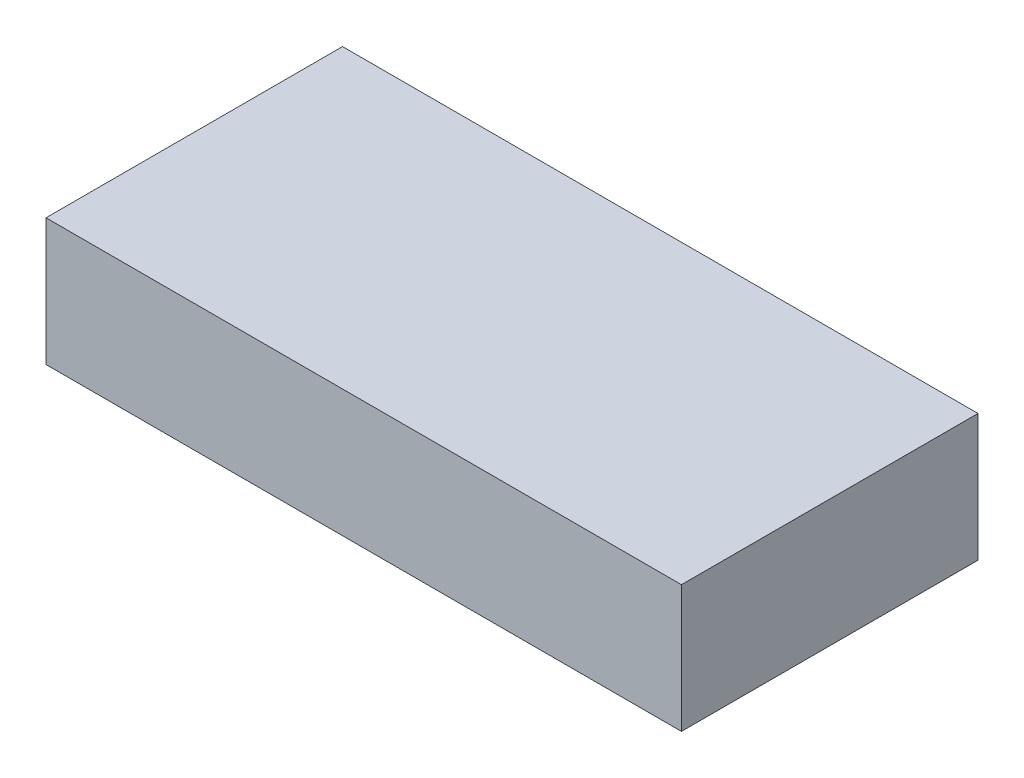
ISO-10303-21;
HEADER;
FILE_DESCRIPTION(('STEP AP214'),'2;1');
FILE_NAME('part.step','',(''),(''),'','','');
FILE_SCHEMA(('AUTOMOTIVE_DESIGN { 1 0 10303 214 1 1 1 1 }'));
ENDSEC;
DATA;
#1=APPLICATION_CONTEXT('core data for automotive mechanical design processes');
#2=APPLICATION_PROTOCOL_DEFINITION('international standard','automotive_design',2000,#1);
#3=PRODUCT_CONTEXT('',#1,'mechanical');
#4=PRODUCT('Part','Part','',(#3));
#5=PRODUCT_RELATED_PRODUCT_CATEGORY('part','',(#4));
#6=PRODUCT_DEFINITION_FORMATION('','',#4);
#7=PRODUCT_DEFINITION_CONTEXT('part definition',#1,'design');
#8=PRODUCT_DEFINITION('design','',#6,#7);
#9=PRODUCT_DEFINITION_SHAPE('','',#8);
#10=(LENGTH_UNIT() NAMED_UNIT(*) SI_UNIT(.MILLI.,.METRE.));
#11=(NAMED_UNIT(*) PLANE_ANGLE_UNIT() SI_UNIT($,.RADIAN.));
#12=(NAMED_UNIT(*) SI_UNIT($,.STERADIAN.) SOLID_ANGLE_UNIT());
#13=UNCERTAINTY_MEASURE_WITH_UNIT(LENGTH_MEASURE(1.E-05),#10,'distance_accuracy_value','');
#14=(GEOMETRIC_REPRESENTATION_CONTEXT(3) GLOBAL_UNCERTAINTY_ASSIGNED_CONTEXT((#13)) GLOBAL_UNIT_ASSIGNED_CONTEXT((#10,
#11,#12)) REPRESENTATION_CONTEXT('',''));
#15=CARTESIAN_POINT('',(0.,0.,0.));
#16=DIRECTION('',(0.,0.,1.));
#17=DIRECTION('',(1.,0.,0.));
#18=AXIS2_PLACEMENT_3D('',#15,#16,#17);
#19=CARTESIAN_POINT('',(-40.4484304932735,15.,-18.2959641255605));
#20=DIRECTION('',(1.,0.,0.));
#21=DIRECTION('',(0.,0.,-1.));
#22=AXIS2_PLACEMENT_3D('',#19,#20,#21);
#23=PLANE('',#22);
#24=DIRECTION('',(0.,0.,1.));
#25=VECTOR('',#24,1.);
#26=CARTESIAN_POINT('',(-40.4484304932735,0.,-18.2959641255605));
#27=LINE('',#26,#25);
#28=CARTESIAN_POINT('',(-40.4484304932735,0.,-18.2959641255605));
#29=VERTEX_POINT('',#28);
#30=CARTESIAN_POINT('',(-40.4484304932735,0.,16.7040358744395));
#31=VERTEX_POINT('',#30);
#32=EDGE_CURVE('E98',#29,#31,#27,.T.);
#33=ORIENTED_EDGE('',*,*,#32,.T.);
#34=DIRECTION('',(0.,-1.,0.));
#35=VECTOR('',#34,1.);
#36=CARTESIAN_POINT('',(-40.4484304932735,15.,16.7040358744395));
#37=LINE('',#36,#35);
#38=CARTESIAN_POINT('',(-40.4484304932735,15.,16.7040358744395));
#39=VERTEX_POINT('',#38);
#40=EDGE_CURVE('E11',#39,#31,#37,.T.);
#41=ORIENTED_EDGE('',*,*,#40,.F.);
#42=DIRECTION('',(0.,0.,1.));
#43=VECTOR('',#42,1.);
#44=CARTESIAN_POINT('',(-40.4484304932735,15.,-18.2959641255605));
#45=LINE('',#44,#43);
#46=CARTESIAN_POINT('',(-40.4484304932735,15.,-18.2959641255605));
#47=VERTEX_POINT('',#46);
#48=EDGE_CURVE('E86',#47,#39,#45,.T.);
#49=ORIENTED_EDGE('',*,*,#48,.F.);
#50=DIRECTION('',(0.,-1.,0.));
#51=VECTOR('',#50,1.);
#52=CARTESIAN_POINT('',(-40.4484304932735,15.,-18.2959641255605));
#53=LINE('',#52,#51);
#54=EDGE_CURVE('E94',#47,#29,#53,.T.);
#55=ORIENTED_EDGE('',*,*,#54,.T.);
#56=EDGE_LOOP('',(#33,#41,#49,#55));
#57=FACE_BOUND('',#56,.T.);
#58=ADVANCED_FACE('F35',(#57),#23,.F.);
#59=CARTESIAN_POINT('',(-40.4484304932735,15.,16.7040358744395));
#60=DIRECTION('',(0.,0.,-1.));
#61=DIRECTION('',(-1.,0.,0.));
#62=AXIS2_PLACEMENT_3D('',#59,#60,#61);
#63=PLANE('',#62);
#64=DIRECTION('',(1.,0.,0.));
#65=VECTOR('',#64,1.);
#66=CARTESIAN_POINT('',(-40.4484304932735,0.,16.7040358744395));
#67=LINE('',#66,#65);
#68=CARTESIAN_POINT('',(34.5515695067265,0.,16.7040358744395));
#69=VERTEX_POINT('',#68);
#70=EDGE_CURVE('E90',#31,#69,#67,.T.);
#71=ORIENTED_EDGE('',*,*,#70,.T.);
#72=DIRECTION('',(0.,-1.,0.));
#73=VECTOR('',#72,1.);
#74=CARTESIAN_POINT('',(34.5515695067265,15.,16.7040358744395));
#75=LINE('',#74,#73);
#76=CARTESIAN_POINT('',(34.5515695067265,15.,16.7040358744395));
#77=VERTEX_POINT('',#76);
#78=EDGE_CURVE('E43',#77,#69,#75,.T.);
#79=ORIENTED_EDGE('',*,*,#78,.F.);
#80=DIRECTION('',(1.,0.,0.));
#81=VECTOR('',#80,1.);
#82=CARTESIAN_POINT('',(-40.4484304932735,15.,16.7040358744395));
#83=LINE('',#82,#81);
#84=EDGE_CURVE('E81',#39,#77,#83,.T.);
#85=ORIENTED_EDGE('',*,*,#84,.F.);
#86=ORIENTED_EDGE('',*,*,#40,.T.);
#87=EDGE_LOOP('',(#71,#79,#85,#86));
#88=FACE_BOUND('',#87,.T.);
#89=ADVANCED_FACE('F89',(#88),#63,.F.);
#90=CARTESIAN_POINT('',(34.5515695067265,15.,-18.2959641255605));
#91=DIRECTION('',(-1.,0.,0.));
#92=DIRECTION('',(0.,0.,1.));
#93=AXIS2_PLACEMENT_3D('',#90,#91,#92);
#94=PLANE('',#93);
#95=DIRECTION('',(0.,0.,-1.));
#96=VECTOR('',#95,1.);
#97=CARTESIAN_POINT('',(34.5515695067265,0.,-18.2959641255605));
#98=LINE('',#97,#96);
#99=CARTESIAN_POINT('',(34.5515695067265,0.,-18.2959641255605));
#100=VERTEX_POINT('',#99);
#101=EDGE_CURVE('E68',#69,#100,#98,.T.);
#102=ORIENTED_EDGE('',*,*,#101,.T.);
#103=DIRECTION('',(0.,-1.,0.));
#104=VECTOR('',#103,1.);
#105=CARTESIAN_POINT('',(34.5515695067265,15.,-18.2959641255605));
#106=LINE('',#105,#104);
#107=CARTESIAN_POINT('',(34.5515695067265,15.,-18.2959641255605));
#108=VERTEX_POINT('',#107);
#109=EDGE_CURVE('E91',#108,#100,#106,.T.);
#110=ORIENTED_EDGE('',*,*,#109,.F.);
#111=DIRECTION('',(0.,0.,-1.));
#112=VECTOR('',#111,1.);
#113=CARTESIAN_POINT('',(34.5515695067265,15.,-18.2959641255605));
#114=LINE('',#113,#112);
#115=EDGE_CURVE('E84',#77,#108,#114,.T.);
#116=ORIENTED_EDGE('',*,*,#115,.F.);
#117=ORIENTED_EDGE('',*,*,#78,.T.);
#118=EDGE_LOOP('',(#102,#110,#116,#117));
#119=FACE_BOUND('',#118,.T.);
#120=ADVANCED_FACE('F92',(#119),#94,.F.);
#121=CARTESIAN_POINT('',(-40.4484304932735,15.,-18.2959641255605));
#122=DIRECTION('',(0.,0.,1.));
#123=DIRECTION('',(1.,0.,0.));
#124=AXIS2_PLACEMENT_3D('',#121,#122,#123);
#125=PLANE('',#124);
#126=DIRECTION('',(-1.,0.,0.));
#127=VECTOR('',#126,1.);
#128=CARTESIAN_POINT('',(-40.4484304932735,0.,-18.2959641255605));
#129=LINE('',#128,#127);
#130=EDGE_CURVE('E74',#100,#29,#129,.T.);
#131=ORIENTED_EDGE('',*,*,#130,.T.);
#132=ORIENTED_EDGE('',*,*,#54,.F.);
#133=DIRECTION('',(-1.,0.,0.));
#134=VECTOR('',#133,1.);
#135=CARTESIAN_POINT('',(-40.4484304932735,15.,-18.2959641255605));
#136=LINE('',#135,#134);
#137=EDGE_CURVE('E51',#108,#47,#136,.T.);
#138=ORIENTED_EDGE('',*,*,#137,.F.);
#139=ORIENTED_EDGE('',*,*,#109,.T.);
#140=EDGE_LOOP('',(#131,#132,#138,#139));
#141=FACE_BOUND('',#140,.T.);
#142=ADVANCED_FACE('F105',(#141),#125,.F.);
#143=CARTESIAN_POINT('',(0.,15.,0.));
#144=DIRECTION('',(0.,1.,0.));
#145=DIRECTION('',(0.,0.,1.));
#146=AXIS2_PLACEMENT_3D('',#143,#144,#145);
#147=PLANE('',#146);
#148=ORIENTED_EDGE('',*,*,#48,.T.);
#149=ORIENTED_EDGE('',*,*,#84,.T.);
#150=ORIENTED_EDGE('',*,*,#115,.T.);
#151=ORIENTED_EDGE('',*,*,#137,.T.);
#152=EDGE_LOOP('',(#148,#149,#150,#151));
#153=FACE_BOUND('',#152,.T.);
#154=ADVANCED_FACE('F82',(#153),#147,.T.);
#155=CARTESIAN_POINT('',(0.,0.,0.));
#156=DIRECTION('',(0.,1.,0.));
#157=DIRECTION('',(0.,0.,1.));
#158=AXIS2_PLACEMENT_3D('',#155,#156,#157);
#159=PLANE('',#158);
#160=ORIENTED_EDGE('',*,*,#32,.F.);
#161=ORIENTED_EDGE('',*,*,#130,.F.);
#162=ORIENTED_EDGE('',*,*,#101,.F.);
#163=ORIENTED_EDGE('',*,*,#70,.F.);
#164=EDGE_LOOP('',(#160,#161,#162,#163));
#165=FACE_BOUND('',#164,.T.);
#166=ADVANCED_FACE('F108',(#165),#159,.F.);
#167=CLOSED_SHELL('',(#58,#89,#120,#142,#154,#166));
#168=MANIFOLD_SOLID_BREP('B2',#167);
#169=ADVANCED_BREP_SHAPE_REPRESENTATION('',(#18,#168),#14);
#170=SHAPE_DEFINITION_REPRESENTATION(#9,#169);
ENDSEC;
END-ISO-10303-21;
